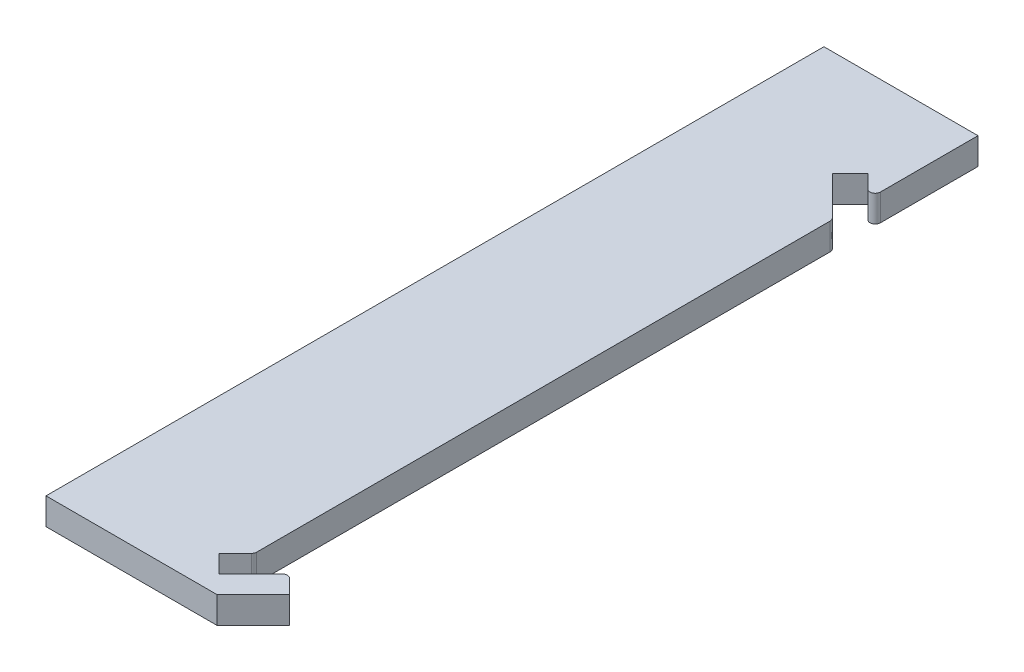
ISO-10303-21;
HEADER;
FILE_DESCRIPTION(('STEP AP214'),'2;1');
FILE_NAME('part.step','',(''),(''),'','','');
FILE_SCHEMA(('AUTOMOTIVE_DESIGN { 1 0 10303 214 1 1 1 1 }'));
ENDSEC;
DATA;
#1=APPLICATION_CONTEXT('core data for automotive mechanical design processes');
#2=APPLICATION_PROTOCOL_DEFINITION('international standard','automotive_design',2000,#1);
#3=PRODUCT_CONTEXT('',#1,'mechanical');
#4=PRODUCT('Part','Part','',(#3));
#5=PRODUCT_RELATED_PRODUCT_CATEGORY('part','',(#4));
#6=PRODUCT_DEFINITION_FORMATION('','',#4);
#7=PRODUCT_DEFINITION_CONTEXT('part definition',#1,'design');
#8=PRODUCT_DEFINITION('design','',#6,#7);
#9=PRODUCT_DEFINITION_SHAPE('','',#8);
#10=(LENGTH_UNIT() NAMED_UNIT(*) SI_UNIT(.MILLI.,.METRE.));
#11=(NAMED_UNIT(*) PLANE_ANGLE_UNIT() SI_UNIT($,.RADIAN.));
#12=(NAMED_UNIT(*) SI_UNIT($,.STERADIAN.) SOLID_ANGLE_UNIT());
#13=UNCERTAINTY_MEASURE_WITH_UNIT(LENGTH_MEASURE(1.E-05),#10,'distance_accuracy_value','');
#14=(GEOMETRIC_REPRESENTATION_CONTEXT(3) GLOBAL_UNCERTAINTY_ASSIGNED_CONTEXT((#13)) GLOBAL_UNIT_ASSIGNED_CONTEXT((#10,
#11,#12)) REPRESENTATION_CONTEXT('',''));
#15=CARTESIAN_POINT('',(0.,0.,0.));
#16=DIRECTION('',(0.,0.,1.));
#17=DIRECTION('',(1.,0.,0.));
#18=AXIS2_PLACEMENT_3D('',#15,#16,#17);
#19=CARTESIAN_POINT('',(30.,-4.8,-19.1421356237311));
#20=DIRECTION('',(-0.707106781186551,0.,-0.707106781186544));
#21=DIRECTION('',(-0.707106781186544,0.,0.707106781186551));
#22=AXIS2_PLACEMENT_3D('',#19,#20,#21);
#23=PLANE('',#22);
#24=DIRECTION('',(0.707106781186544,0.,-0.707106781186551));
#25=VECTOR('',#24,1.);
#26=CARTESIAN_POINT('',(5.42893218813461,0.,5.42893218813456));
#27=LINE('',#26,#25);
#28=CARTESIAN_POINT('',(26.5351767721859,0.,-15.677312395917));
#29=VERTEX_POINT('',#28);
#30=CARTESIAN_POINT('',(29.7071067811866,0.,-18.8492424049176));
#31=VERTEX_POINT('',#30);
#32=EDGE_CURVE('E163',#29,#31,#27,.T.);
#33=ORIENTED_EDGE('',*,*,#32,.T.);
#34=DIRECTION('',(0.,1.,0.));
#35=VECTOR('',#34,1.);
#36=CARTESIAN_POINT('',(29.7071067811866,-4.8,-18.8492424049176));
#37=LINE('',#36,#35);
#38=CARTESIAN_POINT('',(29.7071067811866,5.2,-18.8492424049176));
#39=VERTEX_POINT('',#38);
#40=EDGE_CURVE('E41',#31,#39,#37,.T.);
#41=ORIENTED_EDGE('',*,*,#40,.T.);
#42=DIRECTION('',(-0.707106781186544,0.,0.707106781186551));
#43=VECTOR('',#42,1.);
#44=CARTESIAN_POINT('',(30.,5.2,-19.1421356237311));
#45=LINE('',#44,#43);
#46=CARTESIAN_POINT('',(26.5351767721859,5.2,-15.677312395917));
#47=VERTEX_POINT('',#46);
#48=EDGE_CURVE('E203',#39,#47,#45,.T.);
#49=ORIENTED_EDGE('',*,*,#48,.T.);
#50=DIRECTION('',(0.,1.,0.));
#51=VECTOR('',#50,1.);
#52=CARTESIAN_POINT('',(26.5351767721859,0.,-15.677312395917));
#53=LINE('',#52,#51);
#54=EDGE_CURVE('E195',#29,#47,#53,.T.);
#55=ORIENTED_EDGE('',*,*,#54,.F.);
#56=EDGE_LOOP('',(#33,#41,#49,#55));
#57=FACE_BOUND('',#56,.T.);
#58=ADVANCED_FACE('F33',(#57),#23,.F.);
#59=CARTESIAN_POINT('',(30.,5.2,0.));
#60=DIRECTION('',(-1.,0.,0.));
#61=DIRECTION('',(0.,0.,1.));
#62=AXIS2_PLACEMENT_3D('',#59,#60,#61);
#63=PLANE('',#62);
#64=DIRECTION('',(0.,0.,-1.));
#65=VECTOR('',#64,1.);
#66=CARTESIAN_POINT('',(30.,5.2,0.));
#67=LINE('',#66,#65);
#68=CARTESIAN_POINT('',(30.,5.2,-19.5563491861042));
#69=VERTEX_POINT('',#68);
#70=CARTESIAN_POINT('',(30.,5.2,-131.227922061358));
#71=VERTEX_POINT('',#70);
#72=EDGE_CURVE('E227',#69,#71,#67,.T.);
#73=ORIENTED_EDGE('',*,*,#72,.F.);
#74=DIRECTION('',(0.,1.,0.));
#75=VECTOR('',#74,1.);
#76=CARTESIAN_POINT('',(30.,5.2,-19.5563491861042));
#77=LINE('',#76,#75);
#78=CARTESIAN_POINT('',(30.,0.,-19.5563491861042));
#79=VERTEX_POINT('',#78);
#80=EDGE_CURVE('E11',#69,#79,#77,.F.);
#81=ORIENTED_EDGE('',*,*,#80,.T.);
#82=DIRECTION('',(0.,0.,-1.));
#83=VECTOR('',#82,1.);
#84=CARTESIAN_POINT('',(30.,0.,0.));
#85=LINE('',#84,#83);
#86=CARTESIAN_POINT('',(30.,0.,-131.227922061358));
#87=VERTEX_POINT('',#86);
#88=EDGE_CURVE('E234',#79,#87,#85,.T.);
#89=ORIENTED_EDGE('',*,*,#88,.T.);
#90=DIRECTION('',(0.,1.,0.));
#91=VECTOR('',#90,1.);
#92=CARTESIAN_POINT('',(30.,5.2,-131.227922061358));
#93=LINE('',#92,#91);
#94=EDGE_CURVE('E162',#87,#71,#93,.T.);
#95=ORIENTED_EDGE('',*,*,#94,.T.);
#96=EDGE_LOOP('',(#73,#81,#89,#95));
#97=FACE_BOUND('',#96,.T.);
#98=ADVANCED_FACE('F336',(#97),#63,.F.);
#99=CARTESIAN_POINT('',(0.,5.2,0.));
#100=DIRECTION('',(1.,0.,0.));
#101=DIRECTION('',(0.,0.,-1.));
#102=AXIS2_PLACEMENT_3D('',#99,#100,#101);
#103=PLANE('',#102);
#104=DIRECTION('',(0.,0.,1.));
#105=VECTOR('',#104,1.);
#106=CARTESIAN_POINT('',(0.,0.,0.));
#107=LINE('',#106,#105);
#108=CARTESIAN_POINT('',(0.,0.,-160.));
#109=VERTEX_POINT('',#108);
#110=CARTESIAN_POINT('',(0.,0.,-8.53553390593281));
#111=VERTEX_POINT('',#110);
#112=EDGE_CURVE('E209',#109,#111,#107,.T.);
#113=ORIENTED_EDGE('',*,*,#112,.T.);
#114=DIRECTION('',(0.,1.,0.));
#115=VECTOR('',#114,1.);
#116=CARTESIAN_POINT('',(0.,-4.8,-8.53553390593281));
#117=LINE('',#116,#115);
#118=CARTESIAN_POINT('',(0.,5.2,-8.53553390593281));
#119=VERTEX_POINT('',#118);
#120=EDGE_CURVE('E158',#111,#119,#117,.T.);
#121=ORIENTED_EDGE('',*,*,#120,.T.);
#122=DIRECTION('',(0.,0.,1.));
#123=VECTOR('',#122,1.);
#124=CARTESIAN_POINT('',(0.,5.2,0.));
#125=LINE('',#124,#123);
#126=CARTESIAN_POINT('',(0.,5.2,-160.));
#127=VERTEX_POINT('',#126);
#128=EDGE_CURVE('E221',#127,#119,#125,.T.);
#129=ORIENTED_EDGE('',*,*,#128,.F.);
#130=DIRECTION('',(0.,-1.,0.));
#131=VECTOR('',#130,1.);
#132=CARTESIAN_POINT('',(0.,5.2,-160.));
#133=LINE('',#132,#131);
#134=EDGE_CURVE('E230',#127,#109,#133,.T.);
#135=ORIENTED_EDGE('',*,*,#134,.T.);
#136=EDGE_LOOP('',(#113,#121,#129,#135));
#137=FACE_BOUND('',#136,.T.);
#138=ADVANCED_FACE('F303',(#137),#103,.F.);
#139=CARTESIAN_POINT('',(30.,5.2,-140.985995641732));
#140=VERTEX_POINT('',#139);
#141=CARTESIAN_POINT('',(30.,5.2,-160.));
#142=VERTEX_POINT('',#141);
#143=EDGE_CURVE('E224',#140,#142,#67,.T.);
#144=ORIENTED_EDGE('',*,*,#143,.F.);
#145=DIRECTION('',(0.,1.,0.));
#146=VECTOR('',#145,1.);
#147=CARTESIAN_POINT('',(30.,5.2,-140.985995641732));
#148=LINE('',#147,#146);
#149=CARTESIAN_POINT('',(30.,0.,-140.985995641732));
#150=VERTEX_POINT('',#149);
#151=EDGE_CURVE('E266',#140,#150,#148,.F.);
#152=ORIENTED_EDGE('',*,*,#151,.T.);
#153=CARTESIAN_POINT('',(30.,0.,-160.));
#154=VERTEX_POINT('',#153);
#155=EDGE_CURVE('E232',#150,#154,#85,.T.);
#156=ORIENTED_EDGE('',*,*,#155,.T.);
#157=DIRECTION('',(0.,-1.,0.));
#158=VECTOR('',#157,1.);
#159=CARTESIAN_POINT('',(30.,5.2,-160.));
#160=LINE('',#159,#158);
#161=EDGE_CURVE('E238',#142,#154,#160,.T.);
#162=ORIENTED_EDGE('',*,*,#161,.F.);
#163=EDGE_LOOP('',(#144,#152,#156,#162));
#164=FACE_BOUND('',#163,.T.);
#165=ADVANCED_FACE('F314',(#164),#63,.F.);
#166=CARTESIAN_POINT('',(0.,5.2,-160.));
#167=DIRECTION('',(0.,0.,1.));
#168=DIRECTION('',(1.,0.,0.));
#169=AXIS2_PLACEMENT_3D('',#166,#167,#168);
#170=PLANE('',#169);
#171=DIRECTION('',(-1.,0.,0.));
#172=VECTOR('',#171,1.);
#173=CARTESIAN_POINT('',(0.,0.,-160.));
#174=LINE('',#173,#172);
#175=EDGE_CURVE('E225',#154,#109,#174,.T.);
#176=ORIENTED_EDGE('',*,*,#175,.T.);
#177=ORIENTED_EDGE('',*,*,#134,.F.);
#178=DIRECTION('',(-1.,0.,0.));
#179=VECTOR('',#178,1.);
#180=CARTESIAN_POINT('',(0.,5.2,-160.));
#181=LINE('',#180,#179);
#182=EDGE_CURVE('E228',#142,#127,#181,.T.);
#183=ORIENTED_EDGE('',*,*,#182,.F.);
#184=ORIENTED_EDGE('',*,*,#161,.T.);
#185=EDGE_LOOP('',(#176,#177,#183,#184));
#186=FACE_BOUND('',#185,.T.);
#187=ADVANCED_FACE('F309',(#186),#170,.F.);
#188=CARTESIAN_POINT('',(0.,5.2,0.));
#189=DIRECTION('',(0.,-1.,0.));
#190=DIRECTION('',(0.,0.,-1.));
#191=AXIS2_PLACEMENT_3D('',#188,#189,#190);
#192=PLANE('',#191);
#193=DIRECTION('',(-0.707106781186548,0.,-0.707106781186548));
#194=VECTOR('',#193,1.);
#195=CARTESIAN_POINT('',(40.3237590053236,5.2,-15.6066017177984));
#196=LINE('',#195,#194);
#197=CARTESIAN_POINT('',(40.3237590053236,5.2,-15.6066017177984));
#198=VERTEX_POINT('',#197);
#199=CARTESIAN_POINT('',(37.5660425586961,5.2,-18.3643181644259));
#200=VERTEX_POINT('',#199);
#201=EDGE_CURVE('E191',#198,#200,#196,.T.);
#202=ORIENTED_EDGE('',*,*,#201,.T.);
#203=CARTESIAN_POINT('',(36.8589357775095,5.2,-17.6572113832393));
#204=DIRECTION('',(0.,-1.,0.));
#205=DIRECTION('',(0.,0.,-1.));
#206=AXIS2_PLACEMENT_3D('',#203,#204,#205);
#207=CIRCLE('',#206,1.);
#208=CARTESIAN_POINT('',(36.151828996323,5.2,-18.3643181644259));
#209=VERTEX_POINT('',#208);
#210=EDGE_CURVE('E273',#200,#209,#207,.F.);
#211=ORIENTED_EDGE('',*,*,#210,.T.);
#212=DIRECTION('',(-0.707106781186547,0.,0.707106781186548));
#213=VECTOR('',#212,1.);
#214=CARTESIAN_POINT('',(36.8589357775095,5.2,-19.0714249456124));
#215=LINE('',#214,#213);
#216=CARTESIAN_POINT('',(30.,5.2,-12.2124891681029));
#217=VERTEX_POINT('',#216);
#218=EDGE_CURVE('E184',#209,#217,#215,.T.);
#219=ORIENTED_EDGE('',*,*,#218,.T.);
#220=DIRECTION('',(-0.707106781186548,0.,-0.707106781186547));
#221=VECTOR('',#220,1.);
#222=CARTESIAN_POINT('',(26.5351767721859,5.2,-15.677312395917));
#223=LINE('',#222,#221);
#224=EDGE_CURVE('E179',#217,#47,#223,.T.);
#225=ORIENTED_EDGE('',*,*,#224,.T.);
#226=ORIENTED_EDGE('',*,*,#48,.F.);
#227=CARTESIAN_POINT('',(29.,5.2,-19.5563491861042));
#228=DIRECTION('',(0.,-1.,0.));
#229=DIRECTION('',(0.,0.,-1.));
#230=AXIS2_PLACEMENT_3D('',#227,#228,#229);
#231=CIRCLE('',#230,1.);
#232=EDGE_CURVE('E271',#39,#69,#231,.F.);
#233=ORIENTED_EDGE('',*,*,#232,.T.);
#234=ORIENTED_EDGE('',*,*,#72,.T.);
#235=CARTESIAN_POINT('',(29.,5.2,-131.227922061358));
#236=DIRECTION('',(0.,-1.,0.));
#237=DIRECTION('',(0.,0.,-1.));
#238=AXIS2_PLACEMENT_3D('',#235,#236,#237);
#239=CIRCLE('',#238,1.);
#240=CARTESIAN_POINT('',(29.7071067811865,5.2,-131.935028842545));
#241=VERTEX_POINT('',#240);
#242=EDGE_CURVE('E254',#71,#241,#239,.F.);
#243=ORIENTED_EDGE('',*,*,#242,.T.);
#244=DIRECTION('',(0.707106781186552,0.,0.707106781186543));
#245=VECTOR('',#244,1.);
#246=CARTESIAN_POINT('',(30.,5.2,-131.642135623731));
#247=LINE('',#246,#245);
#248=CARTESIAN_POINT('',(22.2218254069479,5.2,-139.420310216783));
#249=VERTEX_POINT('',#248);
#250=EDGE_CURVE('E214',#249,#241,#247,.T.);
#251=ORIENTED_EDGE('',*,*,#250,.F.);
#252=DIRECTION('',(-0.707106781186548,0.,0.707106781186548));
#253=VECTOR('',#252,1.);
#254=CARTESIAN_POINT('',(22.2218254069479,5.2,-139.420310216783));
#255=LINE('',#254,#253);
#256=CARTESIAN_POINT('',(25.6866486347621,5.2,-142.885133444597));
#257=VERTEX_POINT('',#256);
#258=EDGE_CURVE('E211',#257,#249,#255,.T.);
#259=ORIENTED_EDGE('',*,*,#258,.F.);
#260=DIRECTION('',(-0.707106781186547,0.,-0.707106781186548));
#261=VECTOR('',#260,1.);
#262=CARTESIAN_POINT('',(25.6866486347621,5.2,-142.885133444597));
#263=LINE('',#262,#261);
#264=CARTESIAN_POINT('',(28.2928932188134,5.2,-140.278888860546));
#265=VERTEX_POINT('',#264);
#266=EDGE_CURVE('E198',#265,#257,#263,.T.);
#267=ORIENTED_EDGE('',*,*,#266,.F.);
#268=CARTESIAN_POINT('',(29.,5.2,-140.985995641732));
#269=DIRECTION('',(0.,-1.,0.));
#270=DIRECTION('',(0.,0.,-1.));
#271=AXIS2_PLACEMENT_3D('',#268,#269,#270);
#272=CIRCLE('',#271,1.);
#273=EDGE_CURVE('E252',#265,#140,#272,.F.);
#274=ORIENTED_EDGE('',*,*,#273,.T.);
#275=ORIENTED_EDGE('',*,*,#143,.T.);
#276=ORIENTED_EDGE('',*,*,#182,.T.);
#277=ORIENTED_EDGE('',*,*,#128,.T.);
#278=DIRECTION('',(-1.,0.,0.));
#279=VECTOR('',#278,1.);
#280=CARTESIAN_POINT('',(19.3933982822018,5.2,-8.53553390593282));
#281=LINE('',#280,#279);
#282=CARTESIAN_POINT('',(33.2526911934581,5.2,-8.53553390593287));
#283=VERTEX_POINT('',#282);
#284=EDGE_CURVE('E205',#283,#119,#281,.T.);
#285=ORIENTED_EDGE('',*,*,#284,.F.);
#286=DIRECTION('',(0.707106781186548,0.,-0.707106781186547));
#287=VECTOR('',#286,1.);
#288=CARTESIAN_POINT('',(33.2526911934581,5.2,-8.53553390593287));
#289=LINE('',#288,#287);
#290=EDGE_CURVE('E170',#283,#198,#289,.T.);
#291=ORIENTED_EDGE('',*,*,#290,.T.);
#292=EDGE_LOOP('',(#202,#211,#219,#225,#226,#233,#234,#243,#251,#259,#267,#274,#275,#276,#277,
#285,#291));
#293=FACE_BOUND('',#292,.T.);
#294=ADVANCED_FACE('F285',(#293),#192,.F.);
#295=CARTESIAN_POINT('',(0.,0.,0.));
#296=DIRECTION('',(0.,-1.,0.));
#297=DIRECTION('',(0.,0.,-1.));
#298=AXIS2_PLACEMENT_3D('',#295,#296,#297);
#299=PLANE('',#298);
#300=DIRECTION('',(-0.707106781186547,0.,0.707106781186548));
#301=VECTOR('',#300,1.);
#302=CARTESIAN_POINT('',(36.8589357775095,0.,-19.0714249456124));
#303=LINE('',#302,#301);
#304=CARTESIAN_POINT('',(36.151828996323,0.,-18.3643181644259));
#305=VERTEX_POINT('',#304);
#306=CARTESIAN_POINT('',(30.,0.,-12.2124891681029));
#307=VERTEX_POINT('',#306);
#308=EDGE_CURVE('E181',#305,#307,#303,.T.);
#309=ORIENTED_EDGE('',*,*,#308,.F.);
#310=CARTESIAN_POINT('',(36.8589357775095,0.,-17.6572113832393));
#311=DIRECTION('',(0.,-1.,0.));
#312=DIRECTION('',(0.,0.,-1.));
#313=AXIS2_PLACEMENT_3D('',#310,#311,#312);
#314=CIRCLE('',#313,1.);
#315=CARTESIAN_POINT('',(37.5660425586961,0.,-18.3643181644259));
#316=VERTEX_POINT('',#315);
#317=EDGE_CURVE('E278',#305,#316,#314,.T.);
#318=ORIENTED_EDGE('',*,*,#317,.T.);
#319=DIRECTION('',(-0.707106781186548,0.,-0.707106781186548));
#320=VECTOR('',#319,1.);
#321=CARTESIAN_POINT('',(40.3237590053236,0.,-15.6066017177984));
#322=LINE('',#321,#320);
#323=CARTESIAN_POINT('',(40.3237590053236,0.,-15.6066017177984));
#324=VERTEX_POINT('',#323);
#325=EDGE_CURVE('E178',#324,#316,#322,.T.);
#326=ORIENTED_EDGE('',*,*,#325,.F.);
#327=DIRECTION('',(0.707106781186548,0.,-0.707106781186547));
#328=VECTOR('',#327,1.);
#329=CARTESIAN_POINT('',(33.2526911934581,0.,-8.53553390593287));
#330=LINE('',#329,#328);
#331=CARTESIAN_POINT('',(33.2526911934581,0.,-8.53553390593287));
#332=VERTEX_POINT('',#331);
#333=EDGE_CURVE('E168',#332,#324,#330,.T.);
#334=ORIENTED_EDGE('',*,*,#333,.F.);
#335=DIRECTION('',(1.,0.,0.));
#336=VECTOR('',#335,1.);
#337=CARTESIAN_POINT('',(0.,0.,-8.53553390593281));
#338=LINE('',#337,#336);
#339=EDGE_CURVE('E152',#111,#332,#338,.T.);
#340=ORIENTED_EDGE('',*,*,#339,.F.);
#341=ORIENTED_EDGE('',*,*,#112,.F.);
#342=ORIENTED_EDGE('',*,*,#175,.F.);
#343=ORIENTED_EDGE('',*,*,#155,.F.);
#344=CARTESIAN_POINT('',(29.,0.,-140.985995641732));
#345=DIRECTION('',(0.,-1.,0.));
#346=DIRECTION('',(0.,0.,-1.));
#347=AXIS2_PLACEMENT_3D('',#344,#345,#346);
#348=CIRCLE('',#347,1.);
#349=CARTESIAN_POINT('',(28.2928932188134,0.,-140.278888860546));
#350=VERTEX_POINT('',#349);
#351=EDGE_CURVE('E258',#150,#350,#348,.T.);
#352=ORIENTED_EDGE('',*,*,#351,.T.);
#353=DIRECTION('',(0.707106781186547,0.,0.707106781186548));
#354=VECTOR('',#353,1.);
#355=CARTESIAN_POINT('',(84.2858910396796,0.,-84.2858910396795));
#356=LINE('',#355,#354);
#357=CARTESIAN_POINT('',(25.6866486347621,0.,-142.885133444597));
#358=VERTEX_POINT('',#357);
#359=EDGE_CURVE('E241',#358,#350,#356,.T.);
#360=ORIENTED_EDGE('',*,*,#359,.F.);
#361=DIRECTION('',(0.707106781186548,0.,-0.707106781186548));
#362=VECTOR('',#361,1.);
#363=CARTESIAN_POINT('',(-58.5992424049176,0.,-58.5992424049176));
#364=LINE('',#363,#362);
#365=CARTESIAN_POINT('',(22.2218254069479,0.,-139.420310216783));
#366=VERTEX_POINT('',#365);
#367=EDGE_CURVE('E244',#366,#358,#364,.T.);
#368=ORIENTED_EDGE('',*,*,#367,.F.);
#369=DIRECTION('',(-0.707106781186552,0.,-0.707106781186543));
#370=VECTOR('',#369,1.);
#371=CARTESIAN_POINT('',(80.8210678118653,0.,-80.8210678118664));
#372=LINE('',#371,#370);
#373=CARTESIAN_POINT('',(29.7071067811865,0.,-131.935028842545));
#374=VERTEX_POINT('',#373);
#375=EDGE_CURVE('E247',#374,#366,#372,.T.);
#376=ORIENTED_EDGE('',*,*,#375,.F.);
#377=CARTESIAN_POINT('',(29.,0.,-131.227922061358));
#378=DIRECTION('',(0.,-1.,0.));
#379=DIRECTION('',(0.,0.,-1.));
#380=AXIS2_PLACEMENT_3D('',#377,#378,#379);
#381=CIRCLE('',#380,1.);
#382=EDGE_CURVE('E260',#374,#87,#381,.T.);
#383=ORIENTED_EDGE('',*,*,#382,.T.);
#384=ORIENTED_EDGE('',*,*,#88,.F.);
#385=CARTESIAN_POINT('',(29.,0.,-19.5563491861042));
#386=DIRECTION('',(0.,-1.,0.));
#387=DIRECTION('',(0.,0.,-1.));
#388=AXIS2_PLACEMENT_3D('',#385,#386,#387);
#389=CIRCLE('',#388,1.);
#390=EDGE_CURVE('E48',#79,#31,#389,.T.);
#391=ORIENTED_EDGE('',*,*,#390,.T.);
#392=ORIENTED_EDGE('',*,*,#32,.F.);
#393=DIRECTION('',(-0.707106781186548,0.,-0.707106781186547));
#394=VECTOR('',#393,1.);
#395=CARTESIAN_POINT('',(26.5351767721859,0.,-15.677312395917));
#396=LINE('',#395,#394);
#397=EDGE_CURVE('E172',#307,#29,#396,.T.);
#398=ORIENTED_EDGE('',*,*,#397,.F.);
#399=EDGE_LOOP('',(#309,#318,#326,#334,#340,#341,#342,#343,#352,#360,#368,#376,#383,#384,#391,
#392,#398));
#400=FACE_BOUND('',#399,.T.);
#401=ADVANCED_FACE('F176',(#400),#299,.T.);
#402=CARTESIAN_POINT('',(30.,-4.8,-131.642135623731));
#403=DIRECTION('',(-0.707106781186543,0.,0.707106781186552));
#404=DIRECTION('',(0.707106781186552,0.,0.707106781186543));
#405=AXIS2_PLACEMENT_3D('',#402,#403,#404);
#406=PLANE('',#405);
#407=ORIENTED_EDGE('',*,*,#250,.T.);
#408=DIRECTION('',(0.,1.,0.));
#409=VECTOR('',#408,1.);
#410=CARTESIAN_POINT('',(29.7071067811865,-4.8,-131.935028842545));
#411=LINE('',#410,#409);
#412=EDGE_CURVE('E256',#241,#374,#411,.F.);
#413=ORIENTED_EDGE('',*,*,#412,.T.);
#414=ORIENTED_EDGE('',*,*,#375,.T.);
#415=DIRECTION('',(0.,1.,0.));
#416=VECTOR('',#415,1.);
#417=CARTESIAN_POINT('',(22.2218254069479,-4.8,-139.420310216783));
#418=LINE('',#417,#416);
#419=EDGE_CURVE('E206',#366,#249,#418,.T.);
#420=ORIENTED_EDGE('',*,*,#419,.T.);
#421=EDGE_LOOP('',(#407,#413,#414,#420));
#422=FACE_BOUND('',#421,.T.);
#423=ADVANCED_FACE('F351',(#422),#406,.F.);
#424=CARTESIAN_POINT('',(22.2218254069479,-4.8,-139.420310216783));
#425=DIRECTION('',(-0.707106781186548,0.,-0.707106781186548));
#426=DIRECTION('',(-0.707106781186548,0.,0.707106781186548));
#427=AXIS2_PLACEMENT_3D('',#424,#425,#426);
#428=PLANE('',#427);
#429=ORIENTED_EDGE('',*,*,#367,.T.);
#430=DIRECTION('',(0.,1.,0.));
#431=VECTOR('',#430,1.);
#432=CARTESIAN_POINT('',(25.6866486347621,-4.8,-142.885133444597));
#433=LINE('',#432,#431);
#434=EDGE_CURVE('E217',#358,#257,#433,.T.);
#435=ORIENTED_EDGE('',*,*,#434,.T.);
#436=ORIENTED_EDGE('',*,*,#258,.T.);
#437=ORIENTED_EDGE('',*,*,#419,.F.);
#438=EDGE_LOOP('',(#429,#435,#436,#437));
#439=FACE_BOUND('',#438,.T.);
#440=ADVANCED_FACE('F327',(#439),#428,.F.);
#441=CARTESIAN_POINT('',(25.6866486347621,-4.8,-142.885133444597));
#442=DIRECTION('',(0.707106781186548,0.,-0.707106781186547));
#443=DIRECTION('',(-0.707106781186547,0.,-0.707106781186548));
#444=AXIS2_PLACEMENT_3D('',#441,#442,#443);
#445=PLANE('',#444);
#446=ORIENTED_EDGE('',*,*,#359,.T.);
#447=DIRECTION('',(0.,1.,0.));
#448=VECTOR('',#447,1.);
#449=CARTESIAN_POINT('',(28.2928932188134,-4.8,-140.278888860546));
#450=LINE('',#449,#448);
#451=EDGE_CURVE('E263',#350,#265,#450,.T.);
#452=ORIENTED_EDGE('',*,*,#451,.T.);
#453=ORIENTED_EDGE('',*,*,#266,.T.);
#454=ORIENTED_EDGE('',*,*,#434,.F.);
#455=EDGE_LOOP('',(#446,#452,#453,#454));
#456=FACE_BOUND('',#455,.T.);
#457=ADVANCED_FACE('F322',(#456),#445,.F.);
#458=CARTESIAN_POINT('',(19.3933982822018,-4.8,-8.53553390593282));
#459=DIRECTION('',(0.,0.,-1.));
#460=DIRECTION('',(-1.,0.,0.));
#461=AXIS2_PLACEMENT_3D('',#458,#459,#460);
#462=PLANE('',#461);
#463=ORIENTED_EDGE('',*,*,#339,.T.);
#464=DIRECTION('',(0.,1.,0.));
#465=VECTOR('',#464,1.);
#466=CARTESIAN_POINT('',(33.2526911934581,0.,-8.53553390593287));
#467=LINE('',#466,#465);
#468=EDGE_CURVE('E155',#332,#283,#467,.T.);
#469=ORIENTED_EDGE('',*,*,#468,.T.);
#470=ORIENTED_EDGE('',*,*,#284,.T.);
#471=ORIENTED_EDGE('',*,*,#120,.F.);
#472=EDGE_LOOP('',(#463,#469,#470,#471));
#473=FACE_BOUND('',#472,.T.);
#474=ADVANCED_FACE('F154',(#473),#462,.F.);
#475=CARTESIAN_POINT('',(29.,5.2,-131.227922061358));
#476=DIRECTION('',(0.,1.,0.));
#477=DIRECTION('',(0.,0.,1.));
#478=AXIS2_PLACEMENT_3D('',#475,#476,#477);
#479=CYLINDRICAL_SURFACE('',#478,1.);
#480=ORIENTED_EDGE('',*,*,#382,.F.);
#481=ORIENTED_EDGE('',*,*,#412,.F.);
#482=ORIENTED_EDGE('',*,*,#242,.F.);
#483=ORIENTED_EDGE('',*,*,#94,.F.);
#484=EDGE_LOOP('',(#480,#481,#482,#483));
#485=FACE_BOUND('',#484,.T.);
#486=ADVANCED_FACE('F334',(#485),#479,.T.);
#487=CARTESIAN_POINT('',(29.,-4.8,-140.985995641732));
#488=DIRECTION('',(0.,1.,0.));
#489=DIRECTION('',(0.,0.,1.));
#490=AXIS2_PLACEMENT_3D('',#487,#488,#489);
#491=CYLINDRICAL_SURFACE('',#490,1.);
#492=ORIENTED_EDGE('',*,*,#351,.F.);
#493=ORIENTED_EDGE('',*,*,#151,.F.);
#494=ORIENTED_EDGE('',*,*,#273,.F.);
#495=ORIENTED_EDGE('',*,*,#451,.F.);
#496=EDGE_LOOP('',(#492,#493,#494,#495));
#497=FACE_BOUND('',#496,.T.);
#498=ADVANCED_FACE('F317',(#497),#491,.T.);
#499=CARTESIAN_POINT('',(26.5351767721859,0.,-15.677312395917));
#500=DIRECTION('',(0.707106781186547,0.,-0.707106781186548));
#501=DIRECTION('',(-0.707106781186548,0.,-0.707106781186547));
#502=AXIS2_PLACEMENT_3D('',#499,#500,#501);
#503=PLANE('',#502);
#504=ORIENTED_EDGE('',*,*,#224,.F.);
#505=DIRECTION('',(0.,1.,0.));
#506=VECTOR('',#505,1.);
#507=CARTESIAN_POINT('',(30.,0.,-12.2124891681029));
#508=LINE('',#507,#506);
#509=EDGE_CURVE('E199',#307,#217,#508,.T.);
#510=ORIENTED_EDGE('',*,*,#509,.F.);
#511=ORIENTED_EDGE('',*,*,#397,.T.);
#512=ORIENTED_EDGE('',*,*,#54,.T.);
#513=EDGE_LOOP('',(#504,#510,#511,#512));
#514=FACE_BOUND('',#513,.T.);
#515=ADVANCED_FACE('F290',(#514),#503,.T.);
#516=CARTESIAN_POINT('',(36.8589357775095,0.,-19.0714249456124));
#517=DIRECTION('',(-0.707106781186548,0.,-0.707106781186547));
#518=DIRECTION('',(-0.707106781186547,0.,0.707106781186548));
#519=AXIS2_PLACEMENT_3D('',#516,#517,#518);
#520=PLANE('',#519);
#521=ORIENTED_EDGE('',*,*,#218,.F.);
#522=DIRECTION('',(0.,1.,0.));
#523=VECTOR('',#522,1.);
#524=CARTESIAN_POINT('',(36.151828996323,0.,-18.3643181644259));
#525=LINE('',#524,#523);
#526=EDGE_CURVE('E275',#209,#305,#525,.F.);
#527=ORIENTED_EDGE('',*,*,#526,.T.);
#528=ORIENTED_EDGE('',*,*,#308,.T.);
#529=ORIENTED_EDGE('',*,*,#509,.T.);
#530=EDGE_LOOP('',(#521,#527,#528,#529));
#531=FACE_BOUND('',#530,.T.);
#532=ADVANCED_FACE('F374',(#531),#520,.T.);
#533=CARTESIAN_POINT('',(40.3237590053236,0.,-15.6066017177984));
#534=DIRECTION('',(0.707106781186548,0.,-0.707106781186548));
#535=DIRECTION('',(-0.707106781186548,0.,-0.707106781186548));
#536=AXIS2_PLACEMENT_3D('',#533,#534,#535);
#537=PLANE('',#536);
#538=ORIENTED_EDGE('',*,*,#325,.T.);
#539=DIRECTION('',(0.,1.,0.));
#540=VECTOR('',#539,1.);
#541=CARTESIAN_POINT('',(37.5660425586961,0.,-18.3643181644259));
#542=LINE('',#541,#540);
#543=EDGE_CURVE('E268',#316,#200,#542,.T.);
#544=ORIENTED_EDGE('',*,*,#543,.T.);
#545=ORIENTED_EDGE('',*,*,#201,.F.);
#546=DIRECTION('',(0.,1.,0.));
#547=VECTOR('',#546,1.);
#548=CARTESIAN_POINT('',(40.3237590053236,0.,-15.6066017177984));
#549=LINE('',#548,#547);
#550=EDGE_CURVE('E171',#324,#198,#549,.T.);
#551=ORIENTED_EDGE('',*,*,#550,.F.);
#552=EDGE_LOOP('',(#538,#544,#545,#551));
#553=FACE_BOUND('',#552,.T.);
#554=ADVANCED_FACE('F300',(#553),#537,.T.);
#555=CARTESIAN_POINT('',(33.2526911934581,0.,-8.53553390593287));
#556=DIRECTION('',(0.707106781186547,0.,0.707106781186548));
#557=DIRECTION('',(0.707106781186548,0.,-0.707106781186547));
#558=AXIS2_PLACEMENT_3D('',#555,#556,#557);
#559=PLANE('',#558);
#560=ORIENTED_EDGE('',*,*,#290,.F.);
#561=ORIENTED_EDGE('',*,*,#468,.F.);
#562=ORIENTED_EDGE('',*,*,#333,.T.);
#563=ORIENTED_EDGE('',*,*,#550,.T.);
#564=EDGE_LOOP('',(#560,#561,#562,#563));
#565=FACE_BOUND('',#564,.T.);
#566=ADVANCED_FACE('F167',(#565),#559,.T.);
#567=CARTESIAN_POINT('',(36.8589357775095,0.,-17.6572113832393));
#568=DIRECTION('',(0.,1.,0.));
#569=DIRECTION('',(0.,0.,1.));
#570=AXIS2_PLACEMENT_3D('',#567,#568,#569);
#571=CYLINDRICAL_SURFACE('',#570,1.);
#572=ORIENTED_EDGE('',*,*,#317,.F.);
#573=ORIENTED_EDGE('',*,*,#526,.F.);
#574=ORIENTED_EDGE('',*,*,#210,.F.);
#575=ORIENTED_EDGE('',*,*,#543,.F.);
#576=EDGE_LOOP('',(#572,#573,#574,#575));
#577=FACE_BOUND('',#576,.T.);
#578=ADVANCED_FACE('F297',(#577),#571,.T.);
#579=CARTESIAN_POINT('',(29.,-4.8,-19.5563491861042));
#580=DIRECTION('',(0.,1.,0.));
#581=DIRECTION('',(0.,0.,1.));
#582=AXIS2_PLACEMENT_3D('',#579,#580,#581);
#583=CYLINDRICAL_SURFACE('',#582,1.);
#584=ORIENTED_EDGE('',*,*,#390,.F.);
#585=ORIENTED_EDGE('',*,*,#80,.F.);
#586=ORIENTED_EDGE('',*,*,#232,.F.);
#587=ORIENTED_EDGE('',*,*,#40,.F.);
#588=EDGE_LOOP('',(#584,#585,#586,#587));
#589=FACE_BOUND('',#588,.T.);
#590=ADVANCED_FACE('F35',(#589),#583,.T.);
#591=CLOSED_SHELL('',(#58,#98,#138,#165,#187,#294,#401,#423,#440,#457,#474,#486,#498,#515,#532,
#554,#566,#578,#590));
#592=MANIFOLD_SOLID_BREP('B2',#591);
#593=ADVANCED_BREP_SHAPE_REPRESENTATION('',(#18,#592),#14);
#594=SHAPE_DEFINITION_REPRESENTATION(#9,#593);
ENDSEC;
END-ISO-10303-21;
